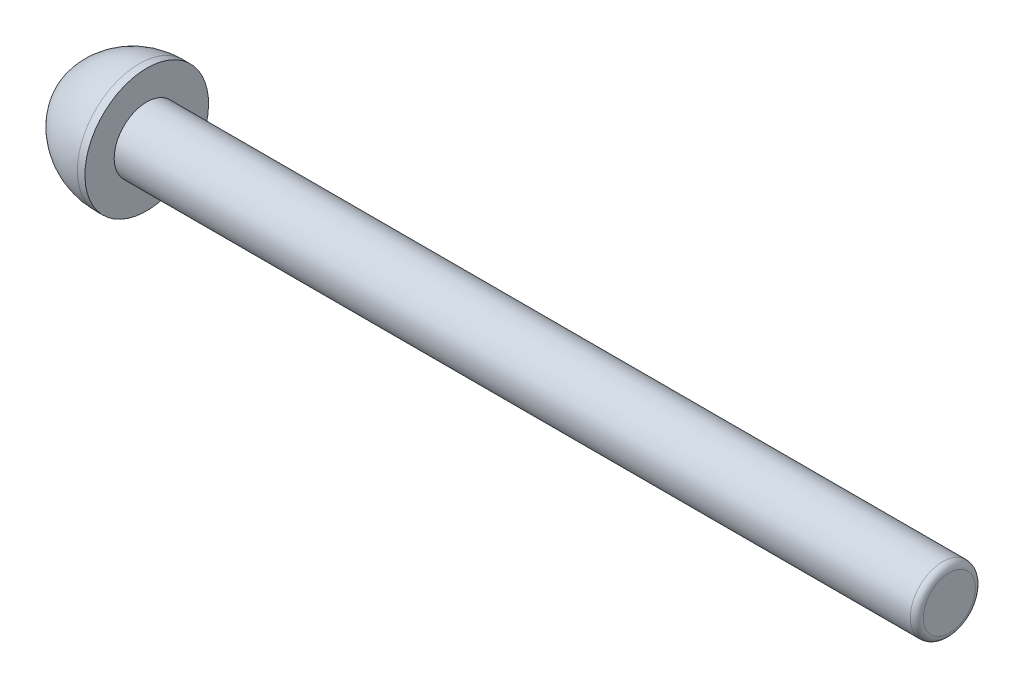
ISO-10303-21;
HEADER;
FILE_DESCRIPTION(('STEP AP214'),'2;1');
FILE_NAME('part.step','',(''),(''),'','','');
FILE_SCHEMA(('AUTOMOTIVE_DESIGN { 1 0 10303 214 1 1 1 1 }'));
ENDSEC;
DATA;
#1=APPLICATION_CONTEXT('core data for automotive mechanical design processes');
#2=APPLICATION_PROTOCOL_DEFINITION('international standard','automotive_design',2000,#1);
#3=PRODUCT_CONTEXT('',#1,'mechanical');
#4=PRODUCT('Part','Part','',(#3));
#5=PRODUCT_RELATED_PRODUCT_CATEGORY('part','',(#4));
#6=PRODUCT_DEFINITION_FORMATION('','',#4);
#7=PRODUCT_DEFINITION_CONTEXT('part definition',#1,'design');
#8=PRODUCT_DEFINITION('design','',#6,#7);
#9=PRODUCT_DEFINITION_SHAPE('','',#8);
#10=(LENGTH_UNIT() NAMED_UNIT(*) SI_UNIT(.MILLI.,.METRE.));
#11=(NAMED_UNIT(*) PLANE_ANGLE_UNIT() SI_UNIT($,.RADIAN.));
#12=(NAMED_UNIT(*) SI_UNIT($,.STERADIAN.) SOLID_ANGLE_UNIT());
#13=UNCERTAINTY_MEASURE_WITH_UNIT(LENGTH_MEASURE(1.E-05),#10,'distance_accuracy_value','');
#14=(GEOMETRIC_REPRESENTATION_CONTEXT(3) GLOBAL_UNCERTAINTY_ASSIGNED_CONTEXT((#13)) GLOBAL_UNIT_ASSIGNED_CONTEXT((#10,
#11,#12)) REPRESENTATION_CONTEXT('',''));
#15=CARTESIAN_POINT('',(0.,0.,0.));
#16=DIRECTION('',(0.,0.,1.));
#17=DIRECTION('',(1.,0.,0.));
#18=AXIS2_PLACEMENT_3D('',#15,#16,#17);
#19=CARTESIAN_POINT('',(40.1648889853776,1.50000000000001,0.));
#20=DIRECTION('',(1.,0.,0.));
#21=DIRECTION('',(0.,1.,0.));
#22=AXIS2_PLACEMENT_3D('',#19,#20,#21);
#23=PLANE('',#22);
#24=CARTESIAN_POINT('',(40.1648889853776,0.,0.));
#25=DIRECTION('',(1.,0.,0.));
#26=DIRECTION('',(0.,1.,0.));
#27=AXIS2_PLACEMENT_3D('',#24,#25,#26);
#28=CIRCLE('',#27,1.20000000000001);
#29=CARTESIAN_POINT('',(40.1648889853776,1.20000000000001,0.));
#30=VERTEX_POINT('',#29);
#31=EDGE_CURVE('E45',#30,#30,#28,.T.);
#32=ORIENTED_EDGE('',*,*,#31,.T.);
#33=EDGE_LOOP('',(#32));
#34=FACE_BOUND('',#33,.T.);
#35=ADVANCED_FACE('F37',(#34),#23,.T.);
#36=CARTESIAN_POINT('',(0.,0.,0.));
#37=DIRECTION('',(-1.,0.,0.));
#38=DIRECTION('',(0.,-1.,0.));
#39=AXIS2_PLACEMENT_3D('',#36,#37,#38);
#40=PLANE('',#39);
#41=DIRECTION('',(0.,0.5,-0.866025403784439));
#42=VECTOR('',#41,1.);
#43=CARTESIAN_POINT('',(0.,0.577350269189626,1.));
#44=LINE('',#43,#42);
#45=CARTESIAN_POINT('',(0.,0.577350269189626,1.));
#46=VERTEX_POINT('',#45);
#47=CARTESIAN_POINT('',(0.,1.15470053837925,0.));
#48=VERTEX_POINT('',#47);
#49=EDGE_CURVE('E52',#46,#48,#44,.T.);
#50=ORIENTED_EDGE('',*,*,#49,.F.);
#51=DIRECTION('',(0.,1.,0.));
#52=VECTOR('',#51,1.);
#53=CARTESIAN_POINT('',(0.,-0.577350269189626,1.));
#54=LINE('',#53,#52);
#55=CARTESIAN_POINT('',(0.,-0.577350269189626,1.));
#56=VERTEX_POINT('',#55);
#57=EDGE_CURVE('E135',#56,#46,#54,.T.);
#58=ORIENTED_EDGE('',*,*,#57,.F.);
#59=DIRECTION('',(0.,0.5,0.866025403784439));
#60=VECTOR('',#59,1.);
#61=CARTESIAN_POINT('',(0.,-1.15470053837925,0.));
#62=LINE('',#61,#60);
#63=CARTESIAN_POINT('',(0.,-1.15470053837925,0.));
#64=VERTEX_POINT('',#63);
#65=EDGE_CURVE('E133',#64,#56,#62,.T.);
#66=ORIENTED_EDGE('',*,*,#65,.F.);
#67=DIRECTION('',(0.,-0.5,0.866025403784438));
#68=VECTOR('',#67,1.);
#69=CARTESIAN_POINT('',(0.,-0.577350269189626,-1.));
#70=LINE('',#69,#68);
#71=CARTESIAN_POINT('',(0.,-0.577350269189626,-1.));
#72=VERTEX_POINT('',#71);
#73=EDGE_CURVE('E100',#72,#64,#70,.T.);
#74=ORIENTED_EDGE('',*,*,#73,.F.);
#75=DIRECTION('',(0.,-1.,0.));
#76=VECTOR('',#75,1.);
#77=CARTESIAN_POINT('',(0.,0.577350269189626,-1.));
#78=LINE('',#77,#76);
#79=CARTESIAN_POINT('',(0.,0.577350269189626,-1.));
#80=VERTEX_POINT('',#79);
#81=EDGE_CURVE('E129',#80,#72,#78,.T.);
#82=ORIENTED_EDGE('',*,*,#81,.F.);
#83=DIRECTION('',(0.,-0.5,-0.866025403784439));
#84=VECTOR('',#83,1.);
#85=CARTESIAN_POINT('',(0.,1.15470053837925,0.));
#86=LINE('',#85,#84);
#87=EDGE_CURVE('E126',#48,#80,#86,.T.);
#88=ORIENTED_EDGE('',*,*,#87,.F.);
#89=EDGE_LOOP('',(#50,#58,#66,#74,#82,#88));
#90=FACE_BOUND('',#89,.T.);
#91=CARTESIAN_POINT('',(0.,0.,0.));
#92=DIRECTION('',(1.,0.,0.));
#93=DIRECTION('',(0.,1.,0.));
#94=AXIS2_PLACEMENT_3D('',#91,#92,#93);
#95=CIRCLE('',#94,1.43);
#96=CARTESIAN_POINT('',(0.,1.43,0.));
#97=VERTEX_POINT('',#96);
#98=EDGE_CURVE('E153',#97,#97,#95,.T.);
#99=ORIENTED_EDGE('',*,*,#98,.F.);
#100=EDGE_LOOP('',(#99));
#101=FACE_BOUND('',#100,.T.);
#102=ADVANCED_FACE('F174',(#90,#101),#40,.T.);
#103=CARTESIAN_POINT('',(2.81488898537757,0.,0.));
#104=DIRECTION('',(1.,0.,0.));
#105=DIRECTION('',(0.,1.,0.));
#106=AXIS2_PLACEMENT_3D('',#103,#104,#105);
#107=DEGENERATE_TOROIDAL_SURFACE('',#106,0.650000000000005,3.5,.F.);
#108=ORIENTED_EDGE('',*,*,#98,.T.);
#109=EDGE_LOOP('',(#108));
#110=FACE_BOUND('',#109,.T.);
#111=CARTESIAN_POINT('',(2.81488898537757,0.,0.));
#112=DIRECTION('',(1.,0.,0.));
#113=DIRECTION('',(0.,1.,0.));
#114=AXIS2_PLACEMENT_3D('',#111,#112,#113);
#115=CIRCLE('',#114,2.85);
#116=CARTESIAN_POINT('',(2.81488898537757,2.85,0.));
#117=VERTEX_POINT('',#116);
#118=EDGE_CURVE('E150',#117,#117,#115,.T.);
#119=ORIENTED_EDGE('',*,*,#118,.F.);
#120=EDGE_LOOP('',(#119));
#121=FACE_BOUND('',#120,.T.);
#122=ADVANCED_FACE('F178',(#110,#121),#107,.F.);
#123=CARTESIAN_POINT('',(40.1648889853776,0.,0.));
#124=DIRECTION('',(1.,0.,0.));
#125=DIRECTION('',(0.,1.,0.));
#126=AXIS2_PLACEMENT_3D('',#123,#124,#125);
#127=CYLINDRICAL_SURFACE('',#126,2.85);
#128=ORIENTED_EDGE('',*,*,#118,.T.);
#129=EDGE_LOOP('',(#128));
#130=FACE_BOUND('',#129,.T.);
#131=CARTESIAN_POINT('',(3.16488898537758,0.,0.));
#132=DIRECTION('',(1.,0.,0.));
#133=DIRECTION('',(0.,1.,0.));
#134=AXIS2_PLACEMENT_3D('',#131,#132,#133);
#135=CIRCLE('',#134,2.85);
#136=CARTESIAN_POINT('',(3.16488898537758,2.85,0.));
#137=VERTEX_POINT('',#136);
#138=EDGE_CURVE('E147',#137,#137,#135,.T.);
#139=ORIENTED_EDGE('',*,*,#138,.F.);
#140=EDGE_LOOP('',(#139));
#141=FACE_BOUND('',#140,.T.);
#142=ADVANCED_FACE('F184',(#130,#141),#127,.T.);
#143=CARTESIAN_POINT('',(3.16488898537757,2.85,0.));
#144=DIRECTION('',(1.,0.,0.));
#145=DIRECTION('',(0.,1.,0.));
#146=AXIS2_PLACEMENT_3D('',#143,#144,#145);
#147=PLANE('',#146);
#148=ORIENTED_EDGE('',*,*,#138,.T.);
#149=EDGE_LOOP('',(#148));
#150=FACE_BOUND('',#149,.T.);
#151=CARTESIAN_POINT('',(3.16488898537758,0.,0.));
#152=DIRECTION('',(1.,0.,0.));
#153=DIRECTION('',(0.,1.,0.));
#154=AXIS2_PLACEMENT_3D('',#151,#152,#153);
#155=CIRCLE('',#154,1.50000000000001);
#156=CARTESIAN_POINT('',(3.16488898537758,1.50000000000001,0.));
#157=VERTEX_POINT('',#156);
#158=EDGE_CURVE('E139',#157,#157,#155,.T.);
#159=ORIENTED_EDGE('',*,*,#158,.F.);
#160=EDGE_LOOP('',(#159));
#161=FACE_BOUND('',#160,.T.);
#162=ADVANCED_FACE('F169',(#150,#161),#147,.T.);
#163=CARTESIAN_POINT('',(40.1648889853776,0.,0.));
#164=DIRECTION('',(1.,0.,0.));
#165=DIRECTION('',(0.,1.,0.));
#166=AXIS2_PLACEMENT_3D('',#163,#164,#165);
#167=CYLINDRICAL_SURFACE('',#166,1.50000000000001);
#168=CARTESIAN_POINT('',(39.8648889853776,0.,0.));
#169=DIRECTION('',(1.,0.,0.));
#170=DIRECTION('',(0.,1.,0.));
#171=AXIS2_PLACEMENT_3D('',#168,#169,#170);
#172=CIRCLE('',#171,1.50000000000001);
#173=CARTESIAN_POINT('',(39.8648889853776,1.50000000000001,0.));
#174=VERTEX_POINT('',#173);
#175=EDGE_CURVE('E11',#174,#174,#172,.F.);
#176=ORIENTED_EDGE('',*,*,#175,.T.);
#177=EDGE_LOOP('',(#176));
#178=FACE_BOUND('',#177,.T.);
#179=ORIENTED_EDGE('',*,*,#158,.T.);
#180=EDGE_LOOP('',(#179));
#181=FACE_BOUND('',#180,.T.);
#182=ADVANCED_FACE('F161',(#178,#181),#167,.T.);
#183=CARTESIAN_POINT('',(39.8648889853776,0.,0.));
#184=DIRECTION('',(1.,0.,0.));
#185=DIRECTION('',(0.,1.,0.));
#186=AXIS2_PLACEMENT_3D('',#183,#184,#185);
#187=TOROIDAL_SURFACE('',#186,1.20000000000001,0.3);
#188=ORIENTED_EDGE('',*,*,#175,.F.);
#189=EDGE_LOOP('',(#188));
#190=FACE_BOUND('',#189,.T.);
#191=ORIENTED_EDGE('',*,*,#31,.F.);
#192=EDGE_LOOP('',(#191));
#193=FACE_BOUND('',#192,.T.);
#194=ADVANCED_FACE('F39',(#190,#193),#187,.T.);
#195=CARTESIAN_POINT('',(1.,0.577350269189626,1.));
#196=DIRECTION('',(0.,0.866025403784439,0.5));
#197=DIRECTION('',(0.,-0.5,0.866025403784439));
#198=AXIS2_PLACEMENT_3D('',#195,#196,#197);
#199=PLANE('',#198);
#200=ORIENTED_EDGE('',*,*,#49,.T.);
#201=DIRECTION('',(-1.,0.,0.));
#202=VECTOR('',#201,1.);
#203=CARTESIAN_POINT('',(1.,1.15470053837925,0.));
#204=LINE('',#203,#202);
#205=CARTESIAN_POINT('',(1.,1.15470053837925,0.));
#206=VERTEX_POINT('',#205);
#207=EDGE_CURVE('E82',#206,#48,#204,.T.);
#208=ORIENTED_EDGE('',*,*,#207,.F.);
#209=DIRECTION('',(0.,0.5,-0.866025403784439));
#210=VECTOR('',#209,1.);
#211=CARTESIAN_POINT('',(1.,0.577350269189626,1.));
#212=LINE('',#211,#210);
#213=CARTESIAN_POINT('',(1.,0.577350269189626,1.));
#214=VERTEX_POINT('',#213);
#215=EDGE_CURVE('E137',#214,#206,#212,.T.);
#216=ORIENTED_EDGE('',*,*,#215,.F.);
#217=DIRECTION('',(-1.,0.,0.));
#218=VECTOR('',#217,1.);
#219=CARTESIAN_POINT('',(1.,0.577350269189626,1.));
#220=LINE('',#219,#218);
#221=EDGE_CURVE('E60',#214,#46,#220,.T.);
#222=ORIENTED_EDGE('',*,*,#221,.T.);
#223=EDGE_LOOP('',(#200,#208,#216,#222));
#224=FACE_BOUND('',#223,.T.);
#225=ADVANCED_FACE('F160',(#224),#199,.F.);
#226=CARTESIAN_POINT('',(1.,-0.577350269189626,1.));
#227=DIRECTION('',(0.,0.,1.));
#228=DIRECTION('',(1.,0.,0.));
#229=AXIS2_PLACEMENT_3D('',#226,#227,#228);
#230=PLANE('',#229);
#231=ORIENTED_EDGE('',*,*,#57,.T.);
#232=ORIENTED_EDGE('',*,*,#221,.F.);
#233=DIRECTION('',(0.,1.,0.));
#234=VECTOR('',#233,1.);
#235=CARTESIAN_POINT('',(1.,-0.577350269189626,1.));
#236=LINE('',#235,#234);
#237=CARTESIAN_POINT('',(1.,-0.577350269189626,1.));
#238=VERTEX_POINT('',#237);
#239=EDGE_CURVE('E112',#238,#214,#236,.T.);
#240=ORIENTED_EDGE('',*,*,#239,.F.);
#241=DIRECTION('',(-1.,0.,0.));
#242=VECTOR('',#241,1.);
#243=CARTESIAN_POINT('',(1.,-0.577350269189626,1.));
#244=LINE('',#243,#242);
#245=EDGE_CURVE('E104',#238,#56,#244,.T.);
#246=ORIENTED_EDGE('',*,*,#245,.T.);
#247=EDGE_LOOP('',(#231,#232,#240,#246));
#248=FACE_BOUND('',#247,.T.);
#249=ADVANCED_FACE('F167',(#248),#230,.F.);
#250=CARTESIAN_POINT('',(1.,-1.15470053837925,0.));
#251=DIRECTION('',(0.,-0.866025403784439,0.5));
#252=DIRECTION('',(0.,-0.5,-0.866025403784439));
#253=AXIS2_PLACEMENT_3D('',#250,#251,#252);
#254=PLANE('',#253);
#255=ORIENTED_EDGE('',*,*,#65,.T.);
#256=ORIENTED_EDGE('',*,*,#245,.F.);
#257=DIRECTION('',(0.,0.5,0.866025403784439));
#258=VECTOR('',#257,1.);
#259=CARTESIAN_POINT('',(1.,-1.15470053837925,0.));
#260=LINE('',#259,#258);
#261=CARTESIAN_POINT('',(1.,-1.15470053837925,0.));
#262=VERTEX_POINT('',#261);
#263=EDGE_CURVE('E108',#262,#238,#260,.T.);
#264=ORIENTED_EDGE('',*,*,#263,.F.);
#265=DIRECTION('',(-1.,0.,0.));
#266=VECTOR('',#265,1.);
#267=CARTESIAN_POINT('',(1.,-1.15470053837925,0.));
#268=LINE('',#267,#266);
#269=EDGE_CURVE('E93',#262,#64,#268,.T.);
#270=ORIENTED_EDGE('',*,*,#269,.T.);
#271=EDGE_LOOP('',(#255,#256,#264,#270));
#272=FACE_BOUND('',#271,.T.);
#273=ADVANCED_FACE('F109',(#272),#254,.F.);
#274=CARTESIAN_POINT('',(1.,-0.577350269189626,-1.));
#275=DIRECTION('',(0.,-0.866025403784439,-0.5));
#276=DIRECTION('',(0.,0.5,-0.866025403784438));
#277=AXIS2_PLACEMENT_3D('',#274,#275,#276);
#278=PLANE('',#277);
#279=ORIENTED_EDGE('',*,*,#73,.T.);
#280=ORIENTED_EDGE('',*,*,#269,.F.);
#281=DIRECTION('',(0.,-0.5,0.866025403784438));
#282=VECTOR('',#281,1.);
#283=CARTESIAN_POINT('',(1.,-0.577350269189626,-1.));
#284=LINE('',#283,#282);
#285=CARTESIAN_POINT('',(1.,-0.577350269189626,-1.));
#286=VERTEX_POINT('',#285);
#287=EDGE_CURVE('E97',#286,#262,#284,.T.);
#288=ORIENTED_EDGE('',*,*,#287,.F.);
#289=DIRECTION('',(-1.,0.,0.));
#290=VECTOR('',#289,1.);
#291=CARTESIAN_POINT('',(1.,-0.577350269189626,-1.));
#292=LINE('',#291,#290);
#293=EDGE_CURVE('E105',#286,#72,#292,.T.);
#294=ORIENTED_EDGE('',*,*,#293,.T.);
#295=EDGE_LOOP('',(#279,#280,#288,#294));
#296=FACE_BOUND('',#295,.T.);
#297=ADVANCED_FACE('F95',(#296),#278,.F.);
#298=CARTESIAN_POINT('',(1.,0.577350269189626,-1.));
#299=DIRECTION('',(0.,0.,-1.));
#300=DIRECTION('',(-1.,0.,0.));
#301=AXIS2_PLACEMENT_3D('',#298,#299,#300);
#302=PLANE('',#301);
#303=ORIENTED_EDGE('',*,*,#81,.T.);
#304=ORIENTED_EDGE('',*,*,#293,.F.);
#305=DIRECTION('',(0.,-1.,0.));
#306=VECTOR('',#305,1.);
#307=CARTESIAN_POINT('',(1.,0.577350269189626,-1.));
#308=LINE('',#307,#306);
#309=CARTESIAN_POINT('',(1.,0.577350269189626,-1.));
#310=VERTEX_POINT('',#309);
#311=EDGE_CURVE('E118',#310,#286,#308,.T.);
#312=ORIENTED_EDGE('',*,*,#311,.F.);
#313=DIRECTION('',(-1.,0.,0.));
#314=VECTOR('',#313,1.);
#315=CARTESIAN_POINT('',(1.,0.577350269189626,-1.));
#316=LINE('',#315,#314);
#317=EDGE_CURVE('E142',#310,#80,#316,.T.);
#318=ORIENTED_EDGE('',*,*,#317,.T.);
#319=EDGE_LOOP('',(#303,#304,#312,#318));
#320=FACE_BOUND('',#319,.T.);
#321=ADVANCED_FACE('F195',(#320),#302,.F.);
#322=CARTESIAN_POINT('',(1.,1.15470053837925,0.));
#323=DIRECTION('',(0.,0.866025403784439,-0.5));
#324=DIRECTION('',(0.,0.5,0.866025403784439));
#325=AXIS2_PLACEMENT_3D('',#322,#323,#324);
#326=PLANE('',#325);
#327=ORIENTED_EDGE('',*,*,#87,.T.);
#328=ORIENTED_EDGE('',*,*,#317,.F.);
#329=DIRECTION('',(0.,-0.5,-0.866025403784439));
#330=VECTOR('',#329,1.);
#331=CARTESIAN_POINT('',(1.,1.15470053837925,0.));
#332=LINE('',#331,#330);
#333=EDGE_CURVE('E120',#206,#310,#332,.T.);
#334=ORIENTED_EDGE('',*,*,#333,.F.);
#335=ORIENTED_EDGE('',*,*,#207,.T.);
#336=EDGE_LOOP('',(#327,#328,#334,#335));
#337=FACE_BOUND('',#336,.T.);
#338=ADVANCED_FACE('F192',(#337),#326,.F.);
#339=CARTESIAN_POINT('',(1.,0.,0.));
#340=DIRECTION('',(-1.,0.,0.));
#341=DIRECTION('',(0.,-1.,0.));
#342=AXIS2_PLACEMENT_3D('',#339,#340,#341);
#343=PLANE('',#342);
#344=ORIENTED_EDGE('',*,*,#215,.T.);
#345=ORIENTED_EDGE('',*,*,#333,.T.);
#346=ORIENTED_EDGE('',*,*,#311,.T.);
#347=ORIENTED_EDGE('',*,*,#287,.T.);
#348=ORIENTED_EDGE('',*,*,#263,.T.);
#349=ORIENTED_EDGE('',*,*,#239,.T.);
#350=EDGE_LOOP('',(#344,#345,#346,#347,#348,#349));
#351=FACE_BOUND('',#350,.T.);
#352=ADVANCED_FACE('F115',(#351),#343,.T.);
#353=CLOSED_SHELL('',(#35,#102,#122,#142,#162,#182,#194,#225,#249,#273,#297,#321,#338,#352));
#354=MANIFOLD_SOLID_BREP('B2',#353);
#355=ADVANCED_BREP_SHAPE_REPRESENTATION('',(#18,#354),#14);
#356=SHAPE_DEFINITION_REPRESENTATION(#9,#355);
ENDSEC;
END-ISO-10303-21;
